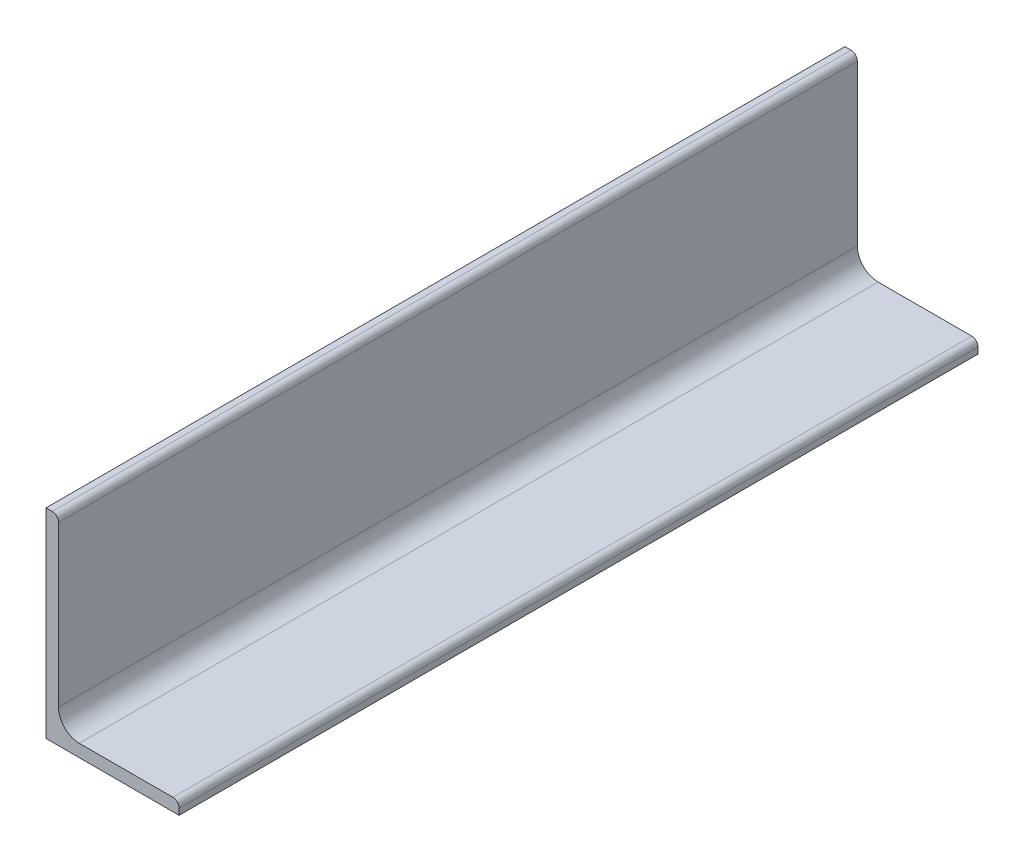
ISO-10303-21;
HEADER;
FILE_DESCRIPTION(('STEP AP214'),'2;1');
FILE_NAME('part.step','',(''),(''),'','','');
FILE_SCHEMA(('AUTOMOTIVE_DESIGN { 1 0 10303 214 1 1 1 1 }'));
ENDSEC;
DATA;
#1=APPLICATION_CONTEXT('core data for automotive mechanical design processes');
#2=APPLICATION_PROTOCOL_DEFINITION('international standard','automotive_design',2000,#1);
#3=PRODUCT_CONTEXT('',#1,'mechanical');
#4=PRODUCT('Part','Part','',(#3));
#5=PRODUCT_RELATED_PRODUCT_CATEGORY('part','',(#4));
#6=PRODUCT_DEFINITION_FORMATION('','',#4);
#7=PRODUCT_DEFINITION_CONTEXT('part definition',#1,'design');
#8=PRODUCT_DEFINITION('design','',#6,#7);
#9=PRODUCT_DEFINITION_SHAPE('','',#8);
#10=(LENGTH_UNIT() NAMED_UNIT(*) SI_UNIT(.MILLI.,.METRE.));
#11=(NAMED_UNIT(*) PLANE_ANGLE_UNIT() SI_UNIT($,.RADIAN.));
#12=(NAMED_UNIT(*) SI_UNIT($,.STERADIAN.) SOLID_ANGLE_UNIT());
#13=UNCERTAINTY_MEASURE_WITH_UNIT(LENGTH_MEASURE(1.E-05),#10,'distance_accuracy_value','');
#14=(GEOMETRIC_REPRESENTATION_CONTEXT(3) GLOBAL_UNCERTAINTY_ASSIGNED_CONTEXT((#13)) GLOBAL_UNIT_ASSIGNED_CONTEXT((#10,
#11,#12)) REPRESENTATION_CONTEXT('',''));
#15=CARTESIAN_POINT('',(0.,0.,0.));
#16=DIRECTION('',(0.,0.,1.));
#17=DIRECTION('',(1.,0.,0.));
#18=AXIS2_PLACEMENT_3D('',#15,#16,#17);
#19=CARTESIAN_POINT('',(0.116507760447575,76.2882459217981,304.8));
#20=DIRECTION('',(1.,0.,0.));
#21=DIRECTION('',(0.,0.,-1.));
#22=AXIS2_PLACEMENT_3D('',#19,#20,#21);
#23=PLANE('',#22);
#24=DIRECTION('',(0.,-1.,0.));
#25=VECTOR('',#24,1.);
#26=CARTESIAN_POINT('',(0.116507760447575,76.2882459217981,0.));
#27=LINE('',#26,#25);
#28=CARTESIAN_POINT('',(0.116507760447575,76.2882459217981,0.));
#29=VERTEX_POINT('',#28);
#30=CARTESIAN_POINT('',(0.116507760447575,0.0882459217980795,0.));
#31=VERTEX_POINT('',#30);
#32=EDGE_CURVE('E135',#29,#31,#27,.T.);
#33=ORIENTED_EDGE('',*,*,#32,.T.);
#34=DIRECTION('',(0.,0.,-1.));
#35=VECTOR('',#34,1.);
#36=CARTESIAN_POINT('',(0.116507760447575,0.0882459217980795,304.8));
#37=LINE('',#36,#35);
#38=CARTESIAN_POINT('',(0.116507760447575,0.0882459217980795,304.8));
#39=VERTEX_POINT('',#38);
#40=EDGE_CURVE('E11',#39,#31,#37,.T.);
#41=ORIENTED_EDGE('',*,*,#40,.F.);
#42=DIRECTION('',(0.,-1.,0.));
#43=VECTOR('',#42,1.);
#44=CARTESIAN_POINT('',(0.116507760447575,76.2882459217981,304.8));
#45=LINE('',#44,#43);
#46=CARTESIAN_POINT('',(0.116507760447575,76.2882459217981,304.8));
#47=VERTEX_POINT('',#46);
#48=EDGE_CURVE('E151',#47,#39,#45,.T.);
#49=ORIENTED_EDGE('',*,*,#48,.F.);
#50=DIRECTION('',(0.,0.,-1.));
#51=VECTOR('',#50,1.);
#52=CARTESIAN_POINT('',(0.116507760447575,76.2882459217981,304.8));
#53=LINE('',#52,#51);
#54=EDGE_CURVE('E131',#47,#29,#53,.T.);
#55=ORIENTED_EDGE('',*,*,#54,.T.);
#56=EDGE_LOOP('',(#33,#41,#49,#55));
#57=FACE_BOUND('',#56,.T.);
#58=ADVANCED_FACE('F33',(#57),#23,.F.);
#59=CARTESIAN_POINT('',(0.116507760447575,0.0882459217980795,304.8));
#60=DIRECTION('',(0.,1.,0.));
#61=DIRECTION('',(0.,0.,1.));
#62=AXIS2_PLACEMENT_3D('',#59,#60,#61);
#63=PLANE('',#62);
#64=DIRECTION('',(1.,0.,0.));
#65=VECTOR('',#64,1.);
#66=CARTESIAN_POINT('',(0.116507760447575,0.0882459217980795,0.));
#67=LINE('',#66,#65);
#68=CARTESIAN_POINT('',(50.9165077604476,0.0882459217980795,0.));
#69=VERTEX_POINT('',#68);
#70=EDGE_CURVE('E138',#31,#69,#67,.T.);
#71=ORIENTED_EDGE('',*,*,#70,.T.);
#72=DIRECTION('',(0.,0.,-1.));
#73=VECTOR('',#72,1.);
#74=CARTESIAN_POINT('',(50.9165077604476,0.0882459217980795,304.8));
#75=LINE('',#74,#73);
#76=CARTESIAN_POINT('',(50.9165077604476,0.0882459217980795,304.8));
#77=VERTEX_POINT('',#76);
#78=EDGE_CURVE('E41',#77,#69,#75,.T.);
#79=ORIENTED_EDGE('',*,*,#78,.F.);
#80=DIRECTION('',(1.,0.,0.));
#81=VECTOR('',#80,1.);
#82=CARTESIAN_POINT('',(0.116507760447575,0.0882459217980795,304.8));
#83=LINE('',#82,#81);
#84=EDGE_CURVE('E95',#39,#77,#83,.T.);
#85=ORIENTED_EDGE('',*,*,#84,.F.);
#86=ORIENTED_EDGE('',*,*,#40,.T.);
#87=EDGE_LOOP('',(#71,#79,#85,#86));
#88=FACE_BOUND('',#87,.T.);
#89=ADVANCED_FACE('F194',(#88),#63,.F.);
#90=CARTESIAN_POINT('',(50.9165077604476,0.0882459217980795,304.8));
#91=DIRECTION('',(-1.,0.,0.));
#92=DIRECTION('',(0.,0.,1.));
#93=AXIS2_PLACEMENT_3D('',#90,#91,#92);
#94=PLANE('',#93);
#95=DIRECTION('',(0.,1.,0.));
#96=VECTOR('',#95,1.);
#97=CARTESIAN_POINT('',(50.9165077604476,0.0882459217980795,0.));
#98=LINE('',#97,#96);
#99=CARTESIAN_POINT('',(50.9165077604476,2.46949592179808,0.));
#100=VERTEX_POINT('',#99);
#101=EDGE_CURVE('E140',#69,#100,#98,.T.);
#102=ORIENTED_EDGE('',*,*,#101,.T.);
#103=DIRECTION('',(0.,0.,-1.));
#104=VECTOR('',#103,1.);
#105=CARTESIAN_POINT('',(50.9165077604476,2.46949592179808,304.8));
#106=LINE('',#105,#104);
#107=CARTESIAN_POINT('',(50.9165077604476,2.46949592179808,304.8));
#108=VERTEX_POINT('',#107);
#109=EDGE_CURVE('E161',#108,#100,#106,.T.);
#110=ORIENTED_EDGE('',*,*,#109,.F.);
#111=DIRECTION('',(0.,1.,0.));
#112=VECTOR('',#111,1.);
#113=CARTESIAN_POINT('',(50.9165077604476,0.0882459217980795,304.8));
#114=LINE('',#113,#112);
#115=EDGE_CURVE('E169',#77,#108,#114,.T.);
#116=ORIENTED_EDGE('',*,*,#115,.F.);
#117=ORIENTED_EDGE('',*,*,#78,.T.);
#118=EDGE_LOOP('',(#102,#110,#116,#117));
#119=FACE_BOUND('',#118,.T.);
#120=ADVANCED_FACE('F167',(#119),#94,.F.);
#121=CARTESIAN_POINT('',(48.5352577604476,2.46949592179808,304.8));
#122=DIRECTION('',(0.,0.,-1.));
#123=DIRECTION('',(-1.,0.,0.));
#124=AXIS2_PLACEMENT_3D('',#121,#122,#123);
#125=CYLINDRICAL_SURFACE('',#124,2.38125);
#126=CARTESIAN_POINT('',(48.5352577604476,2.46949592179808,0.));
#127=DIRECTION('',(0.,0.,1.));
#128=DIRECTION('',(1.,0.,0.));
#129=AXIS2_PLACEMENT_3D('',#126,#127,#128);
#130=CIRCLE('',#129,2.38125);
#131=CARTESIAN_POINT('',(48.5352577604476,4.85074592179808,0.));
#132=VERTEX_POINT('',#131);
#133=EDGE_CURVE('E142',#100,#132,#130,.T.);
#134=ORIENTED_EDGE('',*,*,#133,.T.);
#135=DIRECTION('',(0.,0.,-1.));
#136=VECTOR('',#135,1.);
#137=CARTESIAN_POINT('',(48.5352577604476,4.85074592179808,304.8));
#138=LINE('',#137,#136);
#139=CARTESIAN_POINT('',(48.5352577604476,4.85074592179808,304.8));
#140=VERTEX_POINT('',#139);
#141=EDGE_CURVE('E158',#140,#132,#138,.T.);
#142=ORIENTED_EDGE('',*,*,#141,.F.);
#143=CARTESIAN_POINT('',(48.5352577604476,2.46949592179808,304.8));
#144=DIRECTION('',(0.,0.,1.));
#145=DIRECTION('',(1.,0.,0.));
#146=AXIS2_PLACEMENT_3D('',#143,#144,#145);
#147=CIRCLE('',#146,2.38125);
#148=EDGE_CURVE('E185',#108,#140,#147,.T.);
#149=ORIENTED_EDGE('',*,*,#148,.F.);
#150=ORIENTED_EDGE('',*,*,#109,.T.);
#151=EDGE_LOOP('',(#134,#142,#149,#150));
#152=FACE_BOUND('',#151,.T.);
#153=ADVANCED_FACE('F178',(#152),#125,.T.);
#154=CARTESIAN_POINT('',(48.5352577604476,4.85074592179808,304.8));
#155=DIRECTION('',(0.,-1.,0.));
#156=DIRECTION('',(0.,0.,-1.));
#157=AXIS2_PLACEMENT_3D('',#154,#155,#156);
#158=PLANE('',#157);
#159=DIRECTION('',(-1.,0.,0.));
#160=VECTOR('',#159,1.);
#161=CARTESIAN_POINT('',(48.5352577604476,4.85074592179808,0.));
#162=LINE('',#161,#160);
#163=CARTESIAN_POINT('',(12.8165077604476,4.85074592179808,0.));
#164=VERTEX_POINT('',#163);
#165=EDGE_CURVE('E144',#132,#164,#162,.T.);
#166=ORIENTED_EDGE('',*,*,#165,.T.);
#167=DIRECTION('',(0.,0.,-1.));
#168=VECTOR('',#167,1.);
#169=CARTESIAN_POINT('',(12.8165077604476,4.85074592179808,304.8));
#170=LINE('',#169,#168);
#171=CARTESIAN_POINT('',(12.8165077604476,4.85074592179808,304.8));
#172=VERTEX_POINT('',#171);
#173=EDGE_CURVE('E155',#172,#164,#170,.T.);
#174=ORIENTED_EDGE('',*,*,#173,.F.);
#175=DIRECTION('',(-1.,0.,0.));
#176=VECTOR('',#175,1.);
#177=CARTESIAN_POINT('',(48.5352577604476,4.85074592179808,304.8));
#178=LINE('',#177,#176);
#179=EDGE_CURVE('E184',#140,#172,#178,.T.);
#180=ORIENTED_EDGE('',*,*,#179,.F.);
#181=ORIENTED_EDGE('',*,*,#141,.T.);
#182=EDGE_LOOP('',(#166,#174,#180,#181));
#183=FACE_BOUND('',#182,.T.);
#184=ADVANCED_FACE('F182',(#183),#158,.F.);
#185=CARTESIAN_POINT('',(12.8165077604476,12.7882459217981,304.8));
#186=DIRECTION('',(0.,0.,-1.));
#187=DIRECTION('',(-1.,0.,0.));
#188=AXIS2_PLACEMENT_3D('',#185,#186,#187);
#189=CYLINDRICAL_SURFACE('',#188,7.93749999999999);
#190=CARTESIAN_POINT('',(12.8165077604476,12.7882459217981,0.));
#191=DIRECTION('',(0.,0.,-1.));
#192=DIRECTION('',(1.,0.,0.));
#193=AXIS2_PLACEMENT_3D('',#190,#191,#192);
#194=CIRCLE('',#193,7.93749999999999);
#195=CARTESIAN_POINT('',(4.87900776044758,12.7882459217981,0.));
#196=VERTEX_POINT('',#195);
#197=EDGE_CURVE('E146',#164,#196,#194,.T.);
#198=ORIENTED_EDGE('',*,*,#197,.T.);
#199=DIRECTION('',(0.,0.,-1.));
#200=VECTOR('',#199,1.);
#201=CARTESIAN_POINT('',(4.87900776044758,12.7882459217981,304.8));
#202=LINE('',#201,#200);
#203=CARTESIAN_POINT('',(4.87900776044758,12.7882459217981,304.8));
#204=VERTEX_POINT('',#203);
#205=EDGE_CURVE('E126',#204,#196,#202,.T.);
#206=ORIENTED_EDGE('',*,*,#205,.F.);
#207=CARTESIAN_POINT('',(12.8165077604476,12.7882459217981,304.8));
#208=DIRECTION('',(0.,0.,-1.));
#209=DIRECTION('',(1.,0.,0.));
#210=AXIS2_PLACEMENT_3D('',#207,#208,#209);
#211=CIRCLE('',#210,7.93749999999999);
#212=EDGE_CURVE('E117',#172,#204,#211,.T.);
#213=ORIENTED_EDGE('',*,*,#212,.F.);
#214=ORIENTED_EDGE('',*,*,#173,.T.);
#215=EDGE_LOOP('',(#198,#206,#213,#214));
#216=FACE_BOUND('',#215,.T.);
#217=ADVANCED_FACE('F206',(#216),#189,.F.);
#218=CARTESIAN_POINT('',(4.87900776044758,12.7882459217981,304.8));
#219=DIRECTION('',(-1.,0.,0.));
#220=DIRECTION('',(0.,0.,1.));
#221=AXIS2_PLACEMENT_3D('',#218,#219,#220);
#222=PLANE('',#221);
#223=DIRECTION('',(0.,1.,0.));
#224=VECTOR('',#223,1.);
#225=CARTESIAN_POINT('',(4.87900776044758,12.7882459217981,0.));
#226=LINE('',#225,#224);
#227=CARTESIAN_POINT('',(4.87900776044758,73.9069959217981,0.));
#228=VERTEX_POINT('',#227);
#229=EDGE_CURVE('E125',#196,#228,#226,.T.);
#230=ORIENTED_EDGE('',*,*,#229,.T.);
#231=DIRECTION('',(0.,0.,-1.));
#232=VECTOR('',#231,1.);
#233=CARTESIAN_POINT('',(4.87900776044758,73.9069959217981,304.8));
#234=LINE('',#233,#232);
#235=CARTESIAN_POINT('',(4.87900776044758,73.9069959217981,304.8));
#236=VERTEX_POINT('',#235);
#237=EDGE_CURVE('E122',#236,#228,#234,.T.);
#238=ORIENTED_EDGE('',*,*,#237,.F.);
#239=DIRECTION('',(0.,1.,0.));
#240=VECTOR('',#239,1.);
#241=CARTESIAN_POINT('',(4.87900776044758,12.7882459217981,304.8));
#242=LINE('',#241,#240);
#243=EDGE_CURVE('E111',#204,#236,#242,.T.);
#244=ORIENTED_EDGE('',*,*,#243,.F.);
#245=ORIENTED_EDGE('',*,*,#205,.T.);
#246=EDGE_LOOP('',(#230,#238,#244,#245));
#247=FACE_BOUND('',#246,.T.);
#248=ADVANCED_FACE('F123',(#247),#222,.F.);
#249=CARTESIAN_POINT('',(2.49775776044757,73.9069959217981,304.8));
#250=DIRECTION('',(0.,0.,-1.));
#251=DIRECTION('',(-1.,0.,0.));
#252=AXIS2_PLACEMENT_3D('',#249,#250,#251);
#253=CYLINDRICAL_SURFACE('',#252,2.38125);
#254=CARTESIAN_POINT('',(2.49775776044757,73.9069959217981,0.));
#255=DIRECTION('',(0.,0.,1.));
#256=DIRECTION('',(1.,0.,0.));
#257=AXIS2_PLACEMENT_3D('',#254,#255,#256);
#258=CIRCLE('',#257,2.38125);
#259=CARTESIAN_POINT('',(2.49775776044758,76.2882459217981,0.));
#260=VERTEX_POINT('',#259);
#261=EDGE_CURVE('E81',#228,#260,#258,.T.);
#262=ORIENTED_EDGE('',*,*,#261,.T.);
#263=DIRECTION('',(0.,0.,-1.));
#264=VECTOR('',#263,1.);
#265=CARTESIAN_POINT('',(2.49775776044758,76.2882459217981,304.8));
#266=LINE('',#265,#264);
#267=CARTESIAN_POINT('',(2.49775776044758,76.2882459217981,304.8));
#268=VERTEX_POINT('',#267);
#269=EDGE_CURVE('E127',#268,#260,#266,.T.);
#270=ORIENTED_EDGE('',*,*,#269,.F.);
#271=CARTESIAN_POINT('',(2.49775776044757,73.9069959217981,304.8));
#272=DIRECTION('',(0.,0.,1.));
#273=DIRECTION('',(1.,0.,0.));
#274=AXIS2_PLACEMENT_3D('',#271,#272,#273);
#275=CIRCLE('',#274,2.38125);
#276=EDGE_CURVE('E115',#236,#268,#275,.T.);
#277=ORIENTED_EDGE('',*,*,#276,.F.);
#278=ORIENTED_EDGE('',*,*,#237,.T.);
#279=EDGE_LOOP('',(#262,#270,#277,#278));
#280=FACE_BOUND('',#279,.T.);
#281=ADVANCED_FACE('F129',(#280),#253,.T.);
#282=CARTESIAN_POINT('',(2.49775776044758,76.2882459217981,304.8));
#283=DIRECTION('',(0.,-1.,0.));
#284=DIRECTION('',(0.,0.,-1.));
#285=AXIS2_PLACEMENT_3D('',#282,#283,#284);
#286=PLANE('',#285);
#287=DIRECTION('',(-1.,0.,0.));
#288=VECTOR('',#287,1.);
#289=CARTESIAN_POINT('',(2.49775776044758,76.2882459217981,0.));
#290=LINE('',#289,#288);
#291=EDGE_CURVE('E87',#260,#29,#290,.T.);
#292=ORIENTED_EDGE('',*,*,#291,.T.);
#293=ORIENTED_EDGE('',*,*,#54,.F.);
#294=DIRECTION('',(-1.,0.,0.));
#295=VECTOR('',#294,1.);
#296=CARTESIAN_POINT('',(2.49775776044758,76.2882459217981,304.8));
#297=LINE('',#296,#295);
#298=EDGE_CURVE('E49',#268,#47,#297,.T.);
#299=ORIENTED_EDGE('',*,*,#298,.F.);
#300=ORIENTED_EDGE('',*,*,#269,.T.);
#301=EDGE_LOOP('',(#292,#293,#299,#300));
#302=FACE_BOUND('',#301,.T.);
#303=ADVANCED_FACE('F214',(#302),#286,.F.);
#304=CARTESIAN_POINT('',(48.5352577604476,2.46949592179808,304.8));
#305=DIRECTION('',(0.,0.,1.));
#306=DIRECTION('',(1.,0.,0.));
#307=AXIS2_PLACEMENT_3D('',#304,#305,#306);
#308=PLANE('',#307);
#309=ORIENTED_EDGE('',*,*,#48,.T.);
#310=ORIENTED_EDGE('',*,*,#84,.T.);
#311=ORIENTED_EDGE('',*,*,#115,.T.);
#312=ORIENTED_EDGE('',*,*,#148,.T.);
#313=ORIENTED_EDGE('',*,*,#179,.T.);
#314=ORIENTED_EDGE('',*,*,#212,.T.);
#315=ORIENTED_EDGE('',*,*,#243,.T.);
#316=ORIENTED_EDGE('',*,*,#276,.T.);
#317=ORIENTED_EDGE('',*,*,#298,.T.);
#318=EDGE_LOOP('',(#309,#310,#311,#312,#313,#314,#315,#316,#317));
#319=FACE_BOUND('',#318,.T.);
#320=ADVANCED_FACE('F113',(#319),#308,.T.);
#321=CARTESIAN_POINT('',(48.5352577604476,2.46949592179808,0.));
#322=DIRECTION('',(0.,0.,1.));
#323=DIRECTION('',(1.,0.,0.));
#324=AXIS2_PLACEMENT_3D('',#321,#322,#323);
#325=PLANE('',#324);
#326=ORIENTED_EDGE('',*,*,#32,.F.);
#327=ORIENTED_EDGE('',*,*,#291,.F.);
#328=ORIENTED_EDGE('',*,*,#261,.F.);
#329=ORIENTED_EDGE('',*,*,#229,.F.);
#330=ORIENTED_EDGE('',*,*,#197,.F.);
#331=ORIENTED_EDGE('',*,*,#165,.F.);
#332=ORIENTED_EDGE('',*,*,#133,.F.);
#333=ORIENTED_EDGE('',*,*,#101,.F.);
#334=ORIENTED_EDGE('',*,*,#70,.F.);
#335=EDGE_LOOP('',(#326,#327,#328,#329,#330,#331,#332,#333,#334));
#336=FACE_BOUND('',#335,.T.);
#337=ADVANCED_FACE('F173',(#336),#325,.F.);
#338=CLOSED_SHELL('',(#58,#89,#120,#153,#184,#217,#248,#281,#303,#320,#337));
#339=MANIFOLD_SOLID_BREP('B2',#338);
#340=ADVANCED_BREP_SHAPE_REPRESENTATION('',(#18,#339),#14);
#341=SHAPE_DEFINITION_REPRESENTATION(#9,#340);
ENDSEC;
END-ISO-10303-21;
